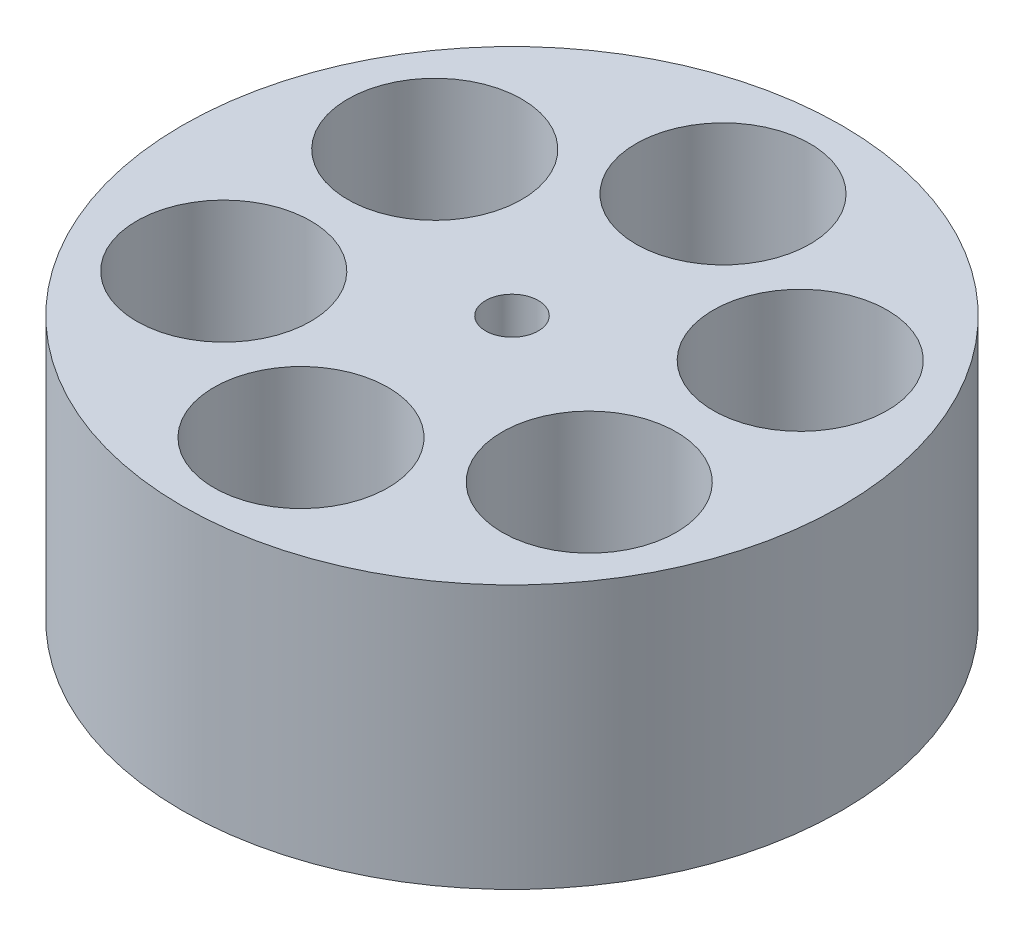
ISO-10303-21;
HEADER;
FILE_DESCRIPTION(('STEP AP214'),'2;1');
FILE_NAME('part.step','',(''),(''),'','','');
FILE_SCHEMA(('AUTOMOTIVE_DESIGN { 1 0 10303 214 1 1 1 1 }'));
ENDSEC;
DATA;
#1=APPLICATION_CONTEXT('core data for automotive mechanical design processes');
#2=APPLICATION_PROTOCOL_DEFINITION('international standard','automotive_design',2000,#1);
#3=PRODUCT_CONTEXT('',#1,'mechanical');
#4=PRODUCT('Part','Part','',(#3));
#5=PRODUCT_RELATED_PRODUCT_CATEGORY('part','',(#4));
#6=PRODUCT_DEFINITION_FORMATION('','',#4);
#7=PRODUCT_DEFINITION_CONTEXT('part definition',#1,'design');
#8=PRODUCT_DEFINITION('design','',#6,#7);
#9=PRODUCT_DEFINITION_SHAPE('','',#8);
#10=(LENGTH_UNIT() NAMED_UNIT(*) SI_UNIT(.MILLI.,.METRE.));
#11=(NAMED_UNIT(*) PLANE_ANGLE_UNIT() SI_UNIT($,.RADIAN.));
#12=(NAMED_UNIT(*) SI_UNIT($,.STERADIAN.) SOLID_ANGLE_UNIT());
#13=UNCERTAINTY_MEASURE_WITH_UNIT(LENGTH_MEASURE(1.E-05),#10,'distance_accuracy_value','');
#14=(GEOMETRIC_REPRESENTATION_CONTEXT(3) GLOBAL_UNCERTAINTY_ASSIGNED_CONTEXT((#13)) GLOBAL_UNIT_ASSIGNED_CONTEXT((#10,
#11,#12)) REPRESENTATION_CONTEXT('',''));
#15=CARTESIAN_POINT('',(0.,0.,0.));
#16=DIRECTION('',(0.,0.,1.));
#17=DIRECTION('',(1.,0.,0.));
#18=AXIS2_PLACEMENT_3D('',#15,#16,#17);
#19=CARTESIAN_POINT('',(0.,20.,0.));
#20=DIRECTION('',(0.,-1.,0.));
#21=DIRECTION('',(0.,0.,-1.));
#22=AXIS2_PLACEMENT_3D('',#19,#20,#21);
#23=CYLINDRICAL_SURFACE('',#22,25.);
#24=CARTESIAN_POINT('',(0.,20.,0.));
#25=DIRECTION('',(0.,1.,0.));
#26=DIRECTION('',(0.,0.,1.));
#27=AXIS2_PLACEMENT_3D('',#24,#25,#26);
#28=CIRCLE('',#27,25.);
#29=CARTESIAN_POINT('',(0.,20.,25.));
#30=VERTEX_POINT('',#29);
#31=EDGE_CURVE('E10',#30,#30,#28,.T.);
#32=ORIENTED_EDGE('',*,*,#31,.F.);
#33=EDGE_LOOP('',(#32));
#34=FACE_BOUND('',#33,.T.);
#35=CARTESIAN_POINT('',(0.,0.,0.));
#36=DIRECTION('',(0.,1.,0.));
#37=DIRECTION('',(0.,0.,1.));
#38=AXIS2_PLACEMENT_3D('',#35,#36,#37);
#39=CIRCLE('',#38,25.);
#40=CARTESIAN_POINT('',(0.,0.,25.));
#41=VERTEX_POINT('',#40);
#42=EDGE_CURVE('E34',#41,#41,#39,.T.);
#43=ORIENTED_EDGE('',*,*,#42,.T.);
#44=EDGE_LOOP('',(#43));
#45=FACE_BOUND('',#44,.T.);
#46=ADVANCED_FACE('F31',(#34,#45),#23,.T.);
#47=CARTESIAN_POINT('',(0.,20.,0.));
#48=DIRECTION('',(0.,1.,0.));
#49=DIRECTION('',(0.,0.,1.));
#50=AXIS2_PLACEMENT_3D('',#47,#48,#49);
#51=PLANE('',#50);
#52=CARTESIAN_POINT('',(0.,20.,0.));
#53=DIRECTION('',(0.,1.,0.));
#54=DIRECTION('',(0.,0.,1.));
#55=AXIS2_PLACEMENT_3D('',#52,#53,#54);
#56=CIRCLE('',#55,2.);
#57=CARTESIAN_POINT('',(0.,20.,2.));
#58=VERTEX_POINT('',#57);
#59=EDGE_CURVE('E114',#58,#58,#56,.T.);
#60=ORIENTED_EDGE('',*,*,#59,.F.);
#61=EDGE_LOOP('',(#60));
#62=FACE_BOUND('',#61,.T.);
#63=CARTESIAN_POINT('',(13.8564064605509,20.,-8.00000000000016));
#64=DIRECTION('',(0.,1.,0.));
#65=DIRECTION('',(-0.866025403784433,0.,0.50000000000001));
#66=AXIS2_PLACEMENT_3D('',#63,#64,#65);
#67=CIRCLE('',#66,6.6);
#68=CARTESIAN_POINT('',(8.14063879557367,20.,-4.70000000000009));
#69=VERTEX_POINT('',#68);
#70=EDGE_CURVE('E79',#69,#69,#67,.T.);
#71=ORIENTED_EDGE('',*,*,#70,.F.);
#72=EDGE_LOOP('',(#71));
#73=FACE_BOUND('',#72,.T.);
#74=CARTESIAN_POINT('',(13.8564064605511,20.,7.99999999999987));
#75=DIRECTION('',(0.,1.,0.));
#76=DIRECTION('',(-0.866025403784443,0.,-0.499999999999992));
#77=AXIS2_PLACEMENT_3D('',#74,#75,#76);
#78=CIRCLE('',#77,6.6);
#79=CARTESIAN_POINT('',(8.14063879557377,20.,4.69999999999992));
#80=VERTEX_POINT('',#79);
#81=EDGE_CURVE('E73',#80,#80,#78,.T.);
#82=ORIENTED_EDGE('',*,*,#81,.F.);
#83=EDGE_LOOP('',(#82));
#84=FACE_BOUND('',#83,.T.);
#85=CARTESIAN_POINT('',(0.,20.,16.));
#86=DIRECTION('',(0.,1.,0.));
#87=DIRECTION('',(0.,0.,-1.));
#88=AXIS2_PLACEMENT_3D('',#85,#86,#87);
#89=CIRCLE('',#88,6.6);
#90=CARTESIAN_POINT('',(0.,20.,9.4));
#91=VERTEX_POINT('',#90);
#92=EDGE_CURVE('E67',#91,#91,#89,.T.);
#93=ORIENTED_EDGE('',*,*,#92,.F.);
#94=EDGE_LOOP('',(#93));
#95=FACE_BOUND('',#94,.T.);
#96=CARTESIAN_POINT('',(-13.856406460551,20.,8.00000000000007));
#97=DIRECTION('',(0.,1.,0.));
#98=DIRECTION('',(0.866025403784436,0.,-0.500000000000004));
#99=AXIS2_PLACEMENT_3D('',#96,#97,#98);
#100=CIRCLE('',#99,6.6);
#101=CARTESIAN_POINT('',(-8.1406387955737,20.,4.70000000000004));
#102=VERTEX_POINT('',#101);
#103=EDGE_CURVE('E61',#102,#102,#100,.T.);
#104=ORIENTED_EDGE('',*,*,#103,.F.);
#105=EDGE_LOOP('',(#104));
#106=FACE_BOUND('',#105,.T.);
#107=CARTESIAN_POINT('',(-13.856406460551,20.,-7.99999999999997));
#108=DIRECTION('',(0.,1.,0.));
#109=DIRECTION('',(0.86602540378444,0.,0.499999999999998));
#110=AXIS2_PLACEMENT_3D('',#107,#108,#109);
#111=CIRCLE('',#110,6.6);
#112=CARTESIAN_POINT('',(-8.14063879557373,20.,-4.69999999999998));
#113=VERTEX_POINT('',#112);
#114=EDGE_CURVE('E55',#113,#113,#111,.T.);
#115=ORIENTED_EDGE('',*,*,#114,.F.);
#116=EDGE_LOOP('',(#115));
#117=FACE_BOUND('',#116,.T.);
#118=CARTESIAN_POINT('',(0.,20.,-16.));
#119=DIRECTION('',(0.,1.,0.));
#120=DIRECTION('',(0.,0.,1.));
#121=AXIS2_PLACEMENT_3D('',#118,#119,#120);
#122=CIRCLE('',#121,6.6);
#123=CARTESIAN_POINT('',(0.,20.,-9.4));
#124=VERTEX_POINT('',#123);
#125=EDGE_CURVE('E43',#124,#124,#122,.T.);
#126=ORIENTED_EDGE('',*,*,#125,.F.);
#127=EDGE_LOOP('',(#126));
#128=FACE_BOUND('',#127,.T.);
#129=ORIENTED_EDGE('',*,*,#31,.T.);
#130=EDGE_LOOP('',(#129));
#131=FACE_BOUND('',#130,.T.);
#132=ADVANCED_FACE('F149',(#62,#73,#84,#95,#106,#117,#128,#131),#51,.T.);
#133=CARTESIAN_POINT('',(0.,0.,0.));
#134=DIRECTION('',(0.,1.,0.));
#135=DIRECTION('',(0.,0.,1.));
#136=AXIS2_PLACEMENT_3D('',#133,#134,#135);
#137=PLANE('',#136);
#138=CARTESIAN_POINT('',(0.,0.,0.));
#139=DIRECTION('',(0.,1.,0.));
#140=DIRECTION('',(0.,0.,1.));
#141=AXIS2_PLACEMENT_3D('',#138,#139,#140);
#142=CIRCLE('',#141,5.);
#143=CARTESIAN_POINT('',(0.,0.,5.));
#144=VERTEX_POINT('',#143);
#145=EDGE_CURVE('E123',#144,#144,#142,.T.);
#146=ORIENTED_EDGE('',*,*,#145,.T.);
#147=EDGE_LOOP('',(#146));
#148=FACE_BOUND('',#147,.T.);
#149=CARTESIAN_POINT('',(13.8564064605509,0.,-8.00000000000016));
#150=DIRECTION('',(0.,1.,0.));
#151=DIRECTION('',(0.,0.,1.));
#152=AXIS2_PLACEMENT_3D('',#149,#150,#151);
#153=CIRCLE('',#152,2.);
#154=CARTESIAN_POINT('',(13.8564064605509,0.,-6.00000000000016));
#155=VERTEX_POINT('',#154);
#156=EDGE_CURVE('E108',#155,#155,#153,.T.);
#157=ORIENTED_EDGE('',*,*,#156,.T.);
#158=EDGE_LOOP('',(#157));
#159=FACE_BOUND('',#158,.T.);
#160=CARTESIAN_POINT('',(13.8564064605511,0.,7.99999999999987));
#161=DIRECTION('',(0.,1.,0.));
#162=DIRECTION('',(0.,0.,1.));
#163=AXIS2_PLACEMENT_3D('',#160,#161,#162);
#164=CIRCLE('',#163,2.);
#165=CARTESIAN_POINT('',(13.8564064605511,0.,9.99999999999987));
#166=VERTEX_POINT('',#165);
#167=EDGE_CURVE('E102',#166,#166,#164,.T.);
#168=ORIENTED_EDGE('',*,*,#167,.T.);
#169=EDGE_LOOP('',(#168));
#170=FACE_BOUND('',#169,.T.);
#171=CARTESIAN_POINT('',(0.,0.,16.));
#172=DIRECTION('',(0.,1.,0.));
#173=DIRECTION('',(0.,0.,1.));
#174=AXIS2_PLACEMENT_3D('',#171,#172,#173);
#175=CIRCLE('',#174,2.);
#176=CARTESIAN_POINT('',(0.,0.,18.));
#177=VERTEX_POINT('',#176);
#178=EDGE_CURVE('E96',#177,#177,#175,.T.);
#179=ORIENTED_EDGE('',*,*,#178,.T.);
#180=EDGE_LOOP('',(#179));
#181=FACE_BOUND('',#180,.T.);
#182=CARTESIAN_POINT('',(-13.856406460551,0.,8.00000000000007));
#183=DIRECTION('',(0.,1.,0.));
#184=DIRECTION('',(0.,0.,1.));
#185=AXIS2_PLACEMENT_3D('',#182,#183,#184);
#186=CIRCLE('',#185,2.);
#187=CARTESIAN_POINT('',(-13.856406460551,0.,10.0000000000001));
#188=VERTEX_POINT('',#187);
#189=EDGE_CURVE('E90',#188,#188,#186,.T.);
#190=ORIENTED_EDGE('',*,*,#189,.T.);
#191=EDGE_LOOP('',(#190));
#192=FACE_BOUND('',#191,.T.);
#193=CARTESIAN_POINT('',(-13.856406460551,0.,-7.99999999999997));
#194=DIRECTION('',(0.,1.,0.));
#195=DIRECTION('',(0.,0.,1.));
#196=AXIS2_PLACEMENT_3D('',#193,#194,#195);
#197=CIRCLE('',#196,2.);
#198=CARTESIAN_POINT('',(-13.856406460551,0.,-5.99999999999997));
#199=VERTEX_POINT('',#198);
#200=EDGE_CURVE('E82',#199,#199,#197,.T.);
#201=ORIENTED_EDGE('',*,*,#200,.T.);
#202=EDGE_LOOP('',(#201));
#203=FACE_BOUND('',#202,.T.);
#204=CARTESIAN_POINT('',(0.,0.,-16.));
#205=DIRECTION('',(0.,1.,0.));
#206=DIRECTION('',(0.,0.,1.));
#207=AXIS2_PLACEMENT_3D('',#204,#205,#206);
#208=CIRCLE('',#207,2.);
#209=CARTESIAN_POINT('',(0.,0.,-14.));
#210=VERTEX_POINT('',#209);
#211=EDGE_CURVE('E46',#210,#210,#208,.T.);
#212=ORIENTED_EDGE('',*,*,#211,.T.);
#213=EDGE_LOOP('',(#212));
#214=FACE_BOUND('',#213,.T.);
#215=ORIENTED_EDGE('',*,*,#42,.F.);
#216=EDGE_LOOP('',(#215));
#217=FACE_BOUND('',#216,.T.);
#218=ADVANCED_FACE('F127',(#148,#159,#170,#181,#192,#203,#214,#217),#137,.F.);
#219=CARTESIAN_POINT('',(0.,10.,-16.));
#220=DIRECTION('',(0.,1.,0.));
#221=DIRECTION('',(0.,0.,1.));
#222=AXIS2_PLACEMENT_3D('',#219,#220,#221);
#223=CYLINDRICAL_SURFACE('',#222,6.6);
#224=CARTESIAN_POINT('',(0.,10.,-16.));
#225=DIRECTION('',(0.,1.,0.));
#226=DIRECTION('',(0.,0.,1.));
#227=AXIS2_PLACEMENT_3D('',#224,#225,#226);
#228=CIRCLE('',#227,6.6);
#229=CARTESIAN_POINT('',(0.,10.,-9.4));
#230=VERTEX_POINT('',#229);
#231=EDGE_CURVE('E41',#230,#230,#228,.T.);
#232=ORIENTED_EDGE('',*,*,#231,.F.);
#233=EDGE_LOOP('',(#232));
#234=FACE_BOUND('',#233,.T.);
#235=ORIENTED_EDGE('',*,*,#125,.T.);
#236=EDGE_LOOP('',(#235));
#237=FACE_BOUND('',#236,.T.);
#238=ADVANCED_FACE('F165',(#234,#237),#223,.F.);
#239=CARTESIAN_POINT('',(0.,10.,-16.));
#240=DIRECTION('',(0.,1.,0.));
#241=DIRECTION('',(0.,0.,1.));
#242=AXIS2_PLACEMENT_3D('',#239,#240,#241);
#243=PLANE('',#242);
#244=CARTESIAN_POINT('',(0.,10.,-16.));
#245=DIRECTION('',(0.,1.,0.));
#246=DIRECTION('',(0.,0.,1.));
#247=AXIS2_PLACEMENT_3D('',#244,#245,#246);
#248=CIRCLE('',#247,2.);
#249=CARTESIAN_POINT('',(0.,10.,-14.));
#250=VERTEX_POINT('',#249);
#251=EDGE_CURVE('E51',#250,#250,#248,.T.);
#252=ORIENTED_EDGE('',*,*,#251,.F.);
#253=EDGE_LOOP('',(#252));
#254=FACE_BOUND('',#253,.T.);
#255=ORIENTED_EDGE('',*,*,#231,.T.);
#256=EDGE_LOOP('',(#255));
#257=FACE_BOUND('',#256,.T.);
#258=ADVANCED_FACE('F167',(#254,#257),#243,.T.);
#259=CARTESIAN_POINT('',(0.,-25.,-16.));
#260=DIRECTION('',(0.,1.,0.));
#261=DIRECTION('',(0.,0.,1.));
#262=AXIS2_PLACEMENT_3D('',#259,#260,#261);
#263=CYLINDRICAL_SURFACE('',#262,2.);
#264=ORIENTED_EDGE('',*,*,#251,.T.);
#265=EDGE_LOOP('',(#264));
#266=FACE_BOUND('',#265,.T.);
#267=ORIENTED_EDGE('',*,*,#211,.F.);
#268=EDGE_LOOP('',(#267));
#269=FACE_BOUND('',#268,.T.);
#270=ADVANCED_FACE('F174',(#266,#269),#263,.F.);
#271=CARTESIAN_POINT('',(-13.856406460551,10.,-7.99999999999997));
#272=DIRECTION('',(0.,1.,0.));
#273=DIRECTION('',(0.,0.,1.));
#274=AXIS2_PLACEMENT_3D('',#271,#272,#273);
#275=CYLINDRICAL_SURFACE('',#274,6.6);
#276=CARTESIAN_POINT('',(-13.856406460551,10.,-7.99999999999997));
#277=DIRECTION('',(0.,1.,0.));
#278=DIRECTION('',(0.86602540378444,0.,0.499999999999998));
#279=AXIS2_PLACEMENT_3D('',#276,#277,#278);
#280=CIRCLE('',#279,6.6);
#281=CARTESIAN_POINT('',(-8.14063879557373,10.,-4.69999999999998));
#282=VERTEX_POINT('',#281);
#283=EDGE_CURVE('E54',#282,#282,#280,.T.);
#284=ORIENTED_EDGE('',*,*,#283,.F.);
#285=EDGE_LOOP('',(#284));
#286=FACE_BOUND('',#285,.T.);
#287=ORIENTED_EDGE('',*,*,#114,.T.);
#288=EDGE_LOOP('',(#287));
#289=FACE_BOUND('',#288,.T.);
#290=ADVANCED_FACE('F326',(#286,#289),#275,.F.);
#291=CARTESIAN_POINT('',(-13.856406460551,10.,-7.99999999999997));
#292=DIRECTION('',(0.,1.,0.));
#293=DIRECTION('',(0.86602540378444,0.,0.499999999999998));
#294=AXIS2_PLACEMENT_3D('',#291,#292,#293);
#295=PLANE('',#294);
#296=CARTESIAN_POINT('',(-13.856406460551,10.,-7.99999999999997));
#297=DIRECTION('',(0.,1.,0.));
#298=DIRECTION('',(0.86602540378444,0.,0.499999999999998));
#299=AXIS2_PLACEMENT_3D('',#296,#297,#298);
#300=CIRCLE('',#299,2.);
#301=CARTESIAN_POINT('',(-12.1243556529822,10.,-6.99999999999997));
#302=VERTEX_POINT('',#301);
#303=EDGE_CURVE('E87',#302,#302,#300,.T.);
#304=ORIENTED_EDGE('',*,*,#303,.F.);
#305=EDGE_LOOP('',(#304));
#306=FACE_BOUND('',#305,.T.);
#307=ORIENTED_EDGE('',*,*,#283,.T.);
#308=EDGE_LOOP('',(#307));
#309=FACE_BOUND('',#308,.T.);
#310=ADVANCED_FACE('F318',(#306,#309),#295,.T.);
#311=CARTESIAN_POINT('',(-13.856406460551,10.,8.00000000000007));
#312=DIRECTION('',(0.,1.,0.));
#313=DIRECTION('',(0.,0.,1.));
#314=AXIS2_PLACEMENT_3D('',#311,#312,#313);
#315=CYLINDRICAL_SURFACE('',#314,6.6);
#316=CARTESIAN_POINT('',(-13.856406460551,10.,8.00000000000007));
#317=DIRECTION('',(0.,1.,0.));
#318=DIRECTION('',(0.866025403784436,0.,-0.500000000000004));
#319=AXIS2_PLACEMENT_3D('',#316,#317,#318);
#320=CIRCLE('',#319,6.6);
#321=CARTESIAN_POINT('',(-8.1406387955737,10.,4.70000000000004));
#322=VERTEX_POINT('',#321);
#323=EDGE_CURVE('E58',#322,#322,#320,.T.);
#324=ORIENTED_EDGE('',*,*,#323,.F.);
#325=EDGE_LOOP('',(#324));
#326=FACE_BOUND('',#325,.T.);
#327=ORIENTED_EDGE('',*,*,#103,.T.);
#328=EDGE_LOOP('',(#327));
#329=FACE_BOUND('',#328,.T.);
#330=ADVANCED_FACE('F310',(#326,#329),#315,.F.);
#331=CARTESIAN_POINT('',(-13.856406460551,10.,8.00000000000007));
#332=DIRECTION('',(0.,1.,0.));
#333=DIRECTION('',(0.866025403784436,0.,-0.500000000000004));
#334=AXIS2_PLACEMENT_3D('',#331,#332,#333);
#335=PLANE('',#334);
#336=CARTESIAN_POINT('',(-13.856406460551,10.,8.00000000000007));
#337=DIRECTION('',(0.,1.,0.));
#338=DIRECTION('',(0.866025403784436,0.,-0.500000000000004));
#339=AXIS2_PLACEMENT_3D('',#336,#337,#338);
#340=CIRCLE('',#339,2.);
#341=CARTESIAN_POINT('',(-12.1243556529821,10.,7.00000000000006));
#342=VERTEX_POINT('',#341);
#343=EDGE_CURVE('E93',#342,#342,#340,.T.);
#344=ORIENTED_EDGE('',*,*,#343,.F.);
#345=EDGE_LOOP('',(#344));
#346=FACE_BOUND('',#345,.T.);
#347=ORIENTED_EDGE('',*,*,#323,.T.);
#348=EDGE_LOOP('',(#347));
#349=FACE_BOUND('',#348,.T.);
#350=ADVANCED_FACE('F302',(#346,#349),#335,.T.);
#351=CARTESIAN_POINT('',(0.,10.,16.));
#352=DIRECTION('',(0.,1.,0.));
#353=DIRECTION('',(0.,0.,1.));
#354=AXIS2_PLACEMENT_3D('',#351,#352,#353);
#355=CYLINDRICAL_SURFACE('',#354,6.6);
#356=CARTESIAN_POINT('',(0.,10.,16.));
#357=DIRECTION('',(0.,1.,0.));
#358=DIRECTION('',(0.,0.,-1.));
#359=AXIS2_PLACEMENT_3D('',#356,#357,#358);
#360=CIRCLE('',#359,6.6);
#361=CARTESIAN_POINT('',(0.,10.,9.4));
#362=VERTEX_POINT('',#361);
#363=EDGE_CURVE('E64',#362,#362,#360,.T.);
#364=ORIENTED_EDGE('',*,*,#363,.F.);
#365=EDGE_LOOP('',(#364));
#366=FACE_BOUND('',#365,.T.);
#367=ORIENTED_EDGE('',*,*,#92,.T.);
#368=EDGE_LOOP('',(#367));
#369=FACE_BOUND('',#368,.T.);
#370=ADVANCED_FACE('F294',(#366,#369),#355,.F.);
#371=CARTESIAN_POINT('',(0.,10.,16.));
#372=DIRECTION('',(0.,1.,0.));
#373=DIRECTION('',(0.,0.,-1.));
#374=AXIS2_PLACEMENT_3D('',#371,#372,#373);
#375=PLANE('',#374);
#376=CARTESIAN_POINT('',(0.,10.,16.));
#377=DIRECTION('',(0.,1.,0.));
#378=DIRECTION('',(0.,0.,-1.));
#379=AXIS2_PLACEMENT_3D('',#376,#377,#378);
#380=CIRCLE('',#379,2.);
#381=CARTESIAN_POINT('',(0.,10.,14.));
#382=VERTEX_POINT('',#381);
#383=EDGE_CURVE('E99',#382,#382,#380,.T.);
#384=ORIENTED_EDGE('',*,*,#383,.F.);
#385=EDGE_LOOP('',(#384));
#386=FACE_BOUND('',#385,.T.);
#387=ORIENTED_EDGE('',*,*,#363,.T.);
#388=EDGE_LOOP('',(#387));
#389=FACE_BOUND('',#388,.T.);
#390=ADVANCED_FACE('F286',(#386,#389),#375,.T.);
#391=CARTESIAN_POINT('',(13.8564064605511,10.,7.99999999999987));
#392=DIRECTION('',(0.,1.,0.));
#393=DIRECTION('',(0.,0.,1.));
#394=AXIS2_PLACEMENT_3D('',#391,#392,#393);
#395=CYLINDRICAL_SURFACE('',#394,6.6);
#396=CARTESIAN_POINT('',(13.8564064605511,10.,7.99999999999987));
#397=DIRECTION('',(0.,1.,0.));
#398=DIRECTION('',(-0.866025403784443,0.,-0.499999999999992));
#399=AXIS2_PLACEMENT_3D('',#396,#397,#398);
#400=CIRCLE('',#399,6.6);
#401=CARTESIAN_POINT('',(8.14063879557377,10.,4.69999999999992));
#402=VERTEX_POINT('',#401);
#403=EDGE_CURVE('E70',#402,#402,#400,.T.);
#404=ORIENTED_EDGE('',*,*,#403,.F.);
#405=EDGE_LOOP('',(#404));
#406=FACE_BOUND('',#405,.T.);
#407=ORIENTED_EDGE('',*,*,#81,.T.);
#408=EDGE_LOOP('',(#407));
#409=FACE_BOUND('',#408,.T.);
#410=ADVANCED_FACE('F278',(#406,#409),#395,.F.);
#411=CARTESIAN_POINT('',(13.8564064605511,10.,7.99999999999987));
#412=DIRECTION('',(0.,1.,0.));
#413=DIRECTION('',(-0.866025403784443,0.,-0.499999999999992));
#414=AXIS2_PLACEMENT_3D('',#411,#412,#413);
#415=PLANE('',#414);
#416=CARTESIAN_POINT('',(13.8564064605511,10.,7.99999999999987));
#417=DIRECTION('',(0.,1.,0.));
#418=DIRECTION('',(-0.866025403784443,0.,-0.499999999999992));
#419=AXIS2_PLACEMENT_3D('',#416,#417,#418);
#420=CIRCLE('',#419,2.);
#421=CARTESIAN_POINT('',(12.1243556529822,10.,6.99999999999989));
#422=VERTEX_POINT('',#421);
#423=EDGE_CURVE('E105',#422,#422,#420,.T.);
#424=ORIENTED_EDGE('',*,*,#423,.F.);
#425=EDGE_LOOP('',(#424));
#426=FACE_BOUND('',#425,.T.);
#427=ORIENTED_EDGE('',*,*,#403,.T.);
#428=EDGE_LOOP('',(#427));
#429=FACE_BOUND('',#428,.T.);
#430=ADVANCED_FACE('F270',(#426,#429),#415,.T.);
#431=CARTESIAN_POINT('',(13.8564064605509,10.,-8.00000000000016));
#432=DIRECTION('',(0.,1.,0.));
#433=DIRECTION('',(0.,0.,1.));
#434=AXIS2_PLACEMENT_3D('',#431,#432,#433);
#435=CYLINDRICAL_SURFACE('',#434,6.6);
#436=CARTESIAN_POINT('',(13.8564064605509,10.,-8.00000000000016));
#437=DIRECTION('',(0.,1.,0.));
#438=DIRECTION('',(-0.866025403784433,0.,0.50000000000001));
#439=AXIS2_PLACEMENT_3D('',#436,#437,#438);
#440=CIRCLE('',#439,6.6);
#441=CARTESIAN_POINT('',(8.14063879557367,10.,-4.70000000000009));
#442=VERTEX_POINT('',#441);
#443=EDGE_CURVE('E76',#442,#442,#440,.T.);
#444=ORIENTED_EDGE('',*,*,#443,.F.);
#445=EDGE_LOOP('',(#444));
#446=FACE_BOUND('',#445,.T.);
#447=ORIENTED_EDGE('',*,*,#70,.T.);
#448=EDGE_LOOP('',(#447));
#449=FACE_BOUND('',#448,.T.);
#450=ADVANCED_FACE('F262',(#446,#449),#435,.F.);
#451=CARTESIAN_POINT('',(13.8564064605509,10.,-8.00000000000016));
#452=DIRECTION('',(0.,1.,0.));
#453=DIRECTION('',(-0.866025403784433,0.,0.50000000000001));
#454=AXIS2_PLACEMENT_3D('',#451,#452,#453);
#455=PLANE('',#454);
#456=CARTESIAN_POINT('',(13.8564064605509,10.,-8.00000000000016));
#457=DIRECTION('',(0.,1.,0.));
#458=DIRECTION('',(-0.866025403784433,0.,0.50000000000001));
#459=AXIS2_PLACEMENT_3D('',#456,#457,#458);
#460=CIRCLE('',#459,2.);
#461=CARTESIAN_POINT('',(12.1243556529821,10.,-7.00000000000014));
#462=VERTEX_POINT('',#461);
#463=EDGE_CURVE('E111',#462,#462,#460,.T.);
#464=ORIENTED_EDGE('',*,*,#463,.F.);
#465=EDGE_LOOP('',(#464));
#466=FACE_BOUND('',#465,.T.);
#467=ORIENTED_EDGE('',*,*,#443,.T.);
#468=EDGE_LOOP('',(#467));
#469=FACE_BOUND('',#468,.T.);
#470=ADVANCED_FACE('F254',(#466,#469),#455,.T.);
#471=CARTESIAN_POINT('',(-13.856406460551,-25.,-7.99999999999997));
#472=DIRECTION('',(0.,1.,0.));
#473=DIRECTION('',(0.,0.,1.));
#474=AXIS2_PLACEMENT_3D('',#471,#472,#473);
#475=CYLINDRICAL_SURFACE('',#474,2.);
#476=ORIENTED_EDGE('',*,*,#303,.T.);
#477=EDGE_LOOP('',(#476));
#478=FACE_BOUND('',#477,.T.);
#479=ORIENTED_EDGE('',*,*,#200,.F.);
#480=EDGE_LOOP('',(#479));
#481=FACE_BOUND('',#480,.T.);
#482=ADVANCED_FACE('F246',(#478,#481),#475,.F.);
#483=CARTESIAN_POINT('',(-13.856406460551,-25.,8.00000000000007));
#484=DIRECTION('',(0.,1.,0.));
#485=DIRECTION('',(0.,0.,1.));
#486=AXIS2_PLACEMENT_3D('',#483,#484,#485);
#487=CYLINDRICAL_SURFACE('',#486,2.);
#488=ORIENTED_EDGE('',*,*,#343,.T.);
#489=EDGE_LOOP('',(#488));
#490=FACE_BOUND('',#489,.T.);
#491=ORIENTED_EDGE('',*,*,#189,.F.);
#492=EDGE_LOOP('',(#491));
#493=FACE_BOUND('',#492,.T.);
#494=ADVANCED_FACE('F238',(#490,#493),#487,.F.);
#495=CARTESIAN_POINT('',(0.,-25.,16.));
#496=DIRECTION('',(0.,1.,0.));
#497=DIRECTION('',(0.,0.,1.));
#498=AXIS2_PLACEMENT_3D('',#495,#496,#497);
#499=CYLINDRICAL_SURFACE('',#498,2.);
#500=ORIENTED_EDGE('',*,*,#383,.T.);
#501=EDGE_LOOP('',(#500));
#502=FACE_BOUND('',#501,.T.);
#503=ORIENTED_EDGE('',*,*,#178,.F.);
#504=EDGE_LOOP('',(#503));
#505=FACE_BOUND('',#504,.T.);
#506=ADVANCED_FACE('F230',(#502,#505),#499,.F.);
#507=CARTESIAN_POINT('',(13.8564064605511,-25.,7.99999999999987));
#508=DIRECTION('',(0.,1.,0.));
#509=DIRECTION('',(0.,0.,1.));
#510=AXIS2_PLACEMENT_3D('',#507,#508,#509);
#511=CYLINDRICAL_SURFACE('',#510,2.);
#512=ORIENTED_EDGE('',*,*,#423,.T.);
#513=EDGE_LOOP('',(#512));
#514=FACE_BOUND('',#513,.T.);
#515=ORIENTED_EDGE('',*,*,#167,.F.);
#516=EDGE_LOOP('',(#515));
#517=FACE_BOUND('',#516,.T.);
#518=ADVANCED_FACE('F223',(#514,#517),#511,.F.);
#519=CARTESIAN_POINT('',(13.8564064605509,-25.,-8.00000000000016));
#520=DIRECTION('',(0.,1.,0.));
#521=DIRECTION('',(0.,0.,1.));
#522=AXIS2_PLACEMENT_3D('',#519,#520,#521);
#523=CYLINDRICAL_SURFACE('',#522,2.);
#524=ORIENTED_EDGE('',*,*,#463,.T.);
#525=EDGE_LOOP('',(#524));
#526=FACE_BOUND('',#525,.T.);
#527=ORIENTED_EDGE('',*,*,#156,.F.);
#528=EDGE_LOOP('',(#527));
#529=FACE_BOUND('',#528,.T.);
#530=ADVANCED_FACE('F145',(#526,#529),#523,.F.);
#531=CARTESIAN_POINT('',(0.,26.0354933639691,0.));
#532=DIRECTION('',(0.,1.,0.));
#533=DIRECTION('',(0.,0.,1.));
#534=AXIS2_PLACEMENT_3D('',#531,#532,#533);
#535=CYLINDRICAL_SURFACE('',#534,2.);
#536=CARTESIAN_POINT('',(0.,6.99999999999999,0.));
#537=DIRECTION('',(0.,1.,0.));
#538=DIRECTION('',(0.,0.,1.));
#539=AXIS2_PLACEMENT_3D('',#536,#537,#538);
#540=CIRCLE('',#539,2.);
#541=CARTESIAN_POINT('',(0.,6.99999999999999,2.));
#542=VERTEX_POINT('',#541);
#543=EDGE_CURVE('E117',#542,#542,#540,.T.);
#544=ORIENTED_EDGE('',*,*,#543,.F.);
#545=EDGE_LOOP('',(#544));
#546=FACE_BOUND('',#545,.T.);
#547=ORIENTED_EDGE('',*,*,#59,.T.);
#548=EDGE_LOOP('',(#547));
#549=FACE_BOUND('',#548,.T.);
#550=ADVANCED_FACE('F139',(#546,#549),#535,.F.);
#551=CARTESIAN_POINT('',(0.,6.99999999999999,0.));
#552=DIRECTION('',(0.,-1.,0.));
#553=DIRECTION('',(0.,0.,-1.));
#554=AXIS2_PLACEMENT_3D('',#551,#552,#553);
#555=CONICAL_SURFACE('',#554,2.,0.78539816339745);
#556=CARTESIAN_POINT('',(0.,4.,0.));
#557=DIRECTION('',(0.,1.,0.));
#558=DIRECTION('',(0.,0.,1.));
#559=AXIS2_PLACEMENT_3D('',#556,#557,#558);
#560=CIRCLE('',#559,5.);
#561=CARTESIAN_POINT('',(0.,4.,5.));
#562=VERTEX_POINT('',#561);
#563=EDGE_CURVE('E120',#562,#562,#560,.T.);
#564=ORIENTED_EDGE('',*,*,#563,.F.);
#565=EDGE_LOOP('',(#564));
#566=FACE_BOUND('',#565,.T.);
#567=ORIENTED_EDGE('',*,*,#543,.T.);
#568=EDGE_LOOP('',(#567));
#569=FACE_BOUND('',#568,.T.);
#570=ADVANCED_FACE('F133',(#566,#569),#555,.F.);
#571=CARTESIAN_POINT('',(0.,26.0354933639691,0.));
#572=DIRECTION('',(0.,1.,0.));
#573=DIRECTION('',(0.,0.,1.));
#574=AXIS2_PLACEMENT_3D('',#571,#572,#573);
#575=CYLINDRICAL_SURFACE('',#574,5.);
#576=ORIENTED_EDGE('',*,*,#145,.F.);
#577=EDGE_LOOP('',(#576));
#578=FACE_BOUND('',#577,.T.);
#579=ORIENTED_EDGE('',*,*,#563,.T.);
#580=EDGE_LOOP('',(#579));
#581=FACE_BOUND('',#580,.T.);
#582=ADVANCED_FACE('F130',(#578,#581),#575,.F.);
#583=CLOSED_SHELL('',(#46,#132,#218,#238,#258,#270,#290,#310,#330,#350,#370,#390,#410,#430,#450,
#470,#482,#494,#506,#518,#530,#550,#570,#582));
#584=MANIFOLD_SOLID_BREP('B2',#583);
#585=ADVANCED_BREP_SHAPE_REPRESENTATION('',(#18,#584),#14);
#586=SHAPE_DEFINITION_REPRESENTATION(#9,#585);
ENDSEC;
END-ISO-10303-21;
